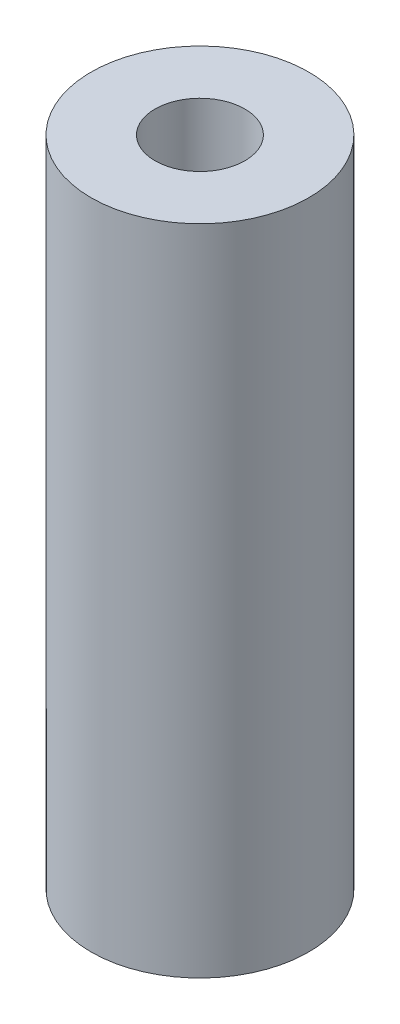
ISO-10303-21;
HEADER;
FILE_DESCRIPTION(('STEP AP214'),'2;1');
FILE_NAME('part.step','',(''),(''),'','','');
FILE_SCHEMA(('AUTOMOTIVE_DESIGN { 1 0 10303 214 1 1 1 1 }'));
ENDSEC;
DATA;
#1=APPLICATION_CONTEXT('core data for automotive mechanical design processes');
#2=APPLICATION_PROTOCOL_DEFINITION('international standard','automotive_design',2000,#1);
#3=PRODUCT_CONTEXT('',#1,'mechanical');
#4=PRODUCT('Part','Part','',(#3));
#5=PRODUCT_RELATED_PRODUCT_CATEGORY('part','',(#4));
#6=PRODUCT_DEFINITION_FORMATION('','',#4);
#7=PRODUCT_DEFINITION_CONTEXT('part definition',#1,'design');
#8=PRODUCT_DEFINITION('design','',#6,#7);
#9=PRODUCT_DEFINITION_SHAPE('','',#8);
#10=(LENGTH_UNIT() NAMED_UNIT(*) SI_UNIT(.MILLI.,.METRE.));
#11=(NAMED_UNIT(*) PLANE_ANGLE_UNIT() SI_UNIT($,.RADIAN.));
#12=(NAMED_UNIT(*) SI_UNIT($,.STERADIAN.) SOLID_ANGLE_UNIT());
#13=UNCERTAINTY_MEASURE_WITH_UNIT(LENGTH_MEASURE(1.E-05),#10,'distance_accuracy_value','');
#14=(GEOMETRIC_REPRESENTATION_CONTEXT(3) GLOBAL_UNCERTAINTY_ASSIGNED_CONTEXT((#13)) GLOBAL_UNIT_ASSIGNED_CONTEXT((#10,
#11,#12)) REPRESENTATION_CONTEXT('',''));
#15=CARTESIAN_POINT('',(0.,0.,0.));
#16=DIRECTION('',(0.,0.,1.));
#17=DIRECTION('',(1.,0.,0.));
#18=AXIS2_PLACEMENT_3D('',#15,#16,#17);
#19=CARTESIAN_POINT('',(0.,24.,0.));
#20=DIRECTION('',(0.,-1.,0.));
#21=DIRECTION('',(0.,0.,-1.));
#22=AXIS2_PLACEMENT_3D('',#19,#20,#21);
#23=CYLINDRICAL_SURFACE('',#22,4.);
#24=CARTESIAN_POINT('',(0.,24.,0.));
#25=DIRECTION('',(0.,1.,0.));
#26=DIRECTION('',(0.,0.,1.));
#27=AXIS2_PLACEMENT_3D('',#24,#25,#26);
#28=CIRCLE('',#27,4.);
#29=CARTESIAN_POINT('',(0.,24.,4.));
#30=VERTEX_POINT('',#29);
#31=EDGE_CURVE('E10',#30,#30,#28,.T.);
#32=ORIENTED_EDGE('',*,*,#31,.F.);
#33=EDGE_LOOP('',(#32));
#34=FACE_BOUND('',#33,.T.);
#35=CARTESIAN_POINT('',(0.,0.,0.));
#36=DIRECTION('',(0.,1.,0.));
#37=DIRECTION('',(0.,0.,1.));
#38=AXIS2_PLACEMENT_3D('',#35,#36,#37);
#39=CIRCLE('',#38,4.);
#40=CARTESIAN_POINT('',(0.,0.,4.));
#41=VERTEX_POINT('',#40);
#42=EDGE_CURVE('E46',#41,#41,#39,.T.);
#43=ORIENTED_EDGE('',*,*,#42,.T.);
#44=EDGE_LOOP('',(#43));
#45=FACE_BOUND('',#44,.T.);
#46=ADVANCED_FACE('F43',(#34,#45),#23,.T.);
#47=CARTESIAN_POINT('',(0.,24.,0.));
#48=DIRECTION('',(0.,1.,0.));
#49=DIRECTION('',(0.,0.,1.));
#50=AXIS2_PLACEMENT_3D('',#47,#48,#49);
#51=PLANE('',#50);
#52=CARTESIAN_POINT('',(0.,24.,0.));
#53=DIRECTION('',(0.,1.,0.));
#54=DIRECTION('',(0.,0.,1.));
#55=AXIS2_PLACEMENT_3D('',#52,#53,#54);
#56=CIRCLE('',#55,1.65);
#57=CARTESIAN_POINT('',(0.,24.,1.65));
#58=VERTEX_POINT('',#57);
#59=EDGE_CURVE('E55',#58,#58,#56,.T.);
#60=ORIENTED_EDGE('',*,*,#59,.F.);
#61=EDGE_LOOP('',(#60));
#62=FACE_BOUND('',#61,.T.);
#63=ORIENTED_EDGE('',*,*,#31,.T.);
#64=EDGE_LOOP('',(#63));
#65=FACE_BOUND('',#64,.T.);
#66=ADVANCED_FACE('F80',(#62,#65),#51,.T.);
#67=CARTESIAN_POINT('',(0.,0.,0.));
#68=DIRECTION('',(0.,1.,0.));
#69=DIRECTION('',(0.,0.,1.));
#70=AXIS2_PLACEMENT_3D('',#67,#68,#69);
#71=PLANE('',#70);
#72=CARTESIAN_POINT('',(0.,0.,0.));
#73=DIRECTION('',(0.,-1.,0.));
#74=DIRECTION('',(0.,0.,-1.));
#75=AXIS2_PLACEMENT_3D('',#72,#73,#74);
#76=CIRCLE('',#75,1.65);
#77=CARTESIAN_POINT('',(0.,0.,-1.65));
#78=VERTEX_POINT('',#77);
#79=EDGE_CURVE('E61',#78,#78,#76,.T.);
#80=ORIENTED_EDGE('',*,*,#79,.F.);
#81=EDGE_LOOP('',(#80));
#82=FACE_BOUND('',#81,.T.);
#83=ORIENTED_EDGE('',*,*,#42,.F.);
#84=EDGE_LOOP('',(#83));
#85=FACE_BOUND('',#84,.T.);
#86=ADVANCED_FACE('F76',(#82,#85),#71,.F.);
#87=CARTESIAN_POINT('',(0.,16.,0.));
#88=DIRECTION('',(0.,1.,0.));
#89=DIRECTION('',(0.,0.,1.));
#90=AXIS2_PLACEMENT_3D('',#87,#88,#89);
#91=CYLINDRICAL_SURFACE('',#90,1.65);
#92=CARTESIAN_POINT('',(0.,16.,0.));
#93=DIRECTION('',(0.,1.,0.));
#94=DIRECTION('',(0.,0.,1.));
#95=AXIS2_PLACEMENT_3D('',#92,#93,#94);
#96=CIRCLE('',#95,1.65);
#97=CARTESIAN_POINT('',(0.,16.,1.65));
#98=VERTEX_POINT('',#97);
#99=EDGE_CURVE('E53',#98,#98,#96,.T.);
#100=ORIENTED_EDGE('',*,*,#99,.F.);
#101=EDGE_LOOP('',(#100));
#102=FACE_BOUND('',#101,.T.);
#103=ORIENTED_EDGE('',*,*,#59,.T.);
#104=EDGE_LOOP('',(#103));
#105=FACE_BOUND('',#104,.T.);
#106=ADVANCED_FACE('F79',(#102,#105),#91,.F.);
#107=CARTESIAN_POINT('',(0.,16.,0.));
#108=DIRECTION('',(0.,1.,0.));
#109=DIRECTION('',(0.,0.,1.));
#110=AXIS2_PLACEMENT_3D('',#107,#108,#109);
#111=PLANE('',#110);
#112=ORIENTED_EDGE('',*,*,#99,.T.);
#113=EDGE_LOOP('',(#112));
#114=FACE_BOUND('',#113,.T.);
#115=ADVANCED_FACE('F72',(#114),#111,.T.);
#116=CARTESIAN_POINT('',(0.,8.,0.));
#117=DIRECTION('',(0.,-1.,0.));
#118=DIRECTION('',(0.,0.,-1.));
#119=AXIS2_PLACEMENT_3D('',#116,#117,#118);
#120=CYLINDRICAL_SURFACE('',#119,1.65);
#121=CARTESIAN_POINT('',(0.,8.,0.));
#122=DIRECTION('',(0.,-1.,0.));
#123=DIRECTION('',(0.,0.,-1.));
#124=AXIS2_PLACEMENT_3D('',#121,#122,#123);
#125=CIRCLE('',#124,1.65);
#126=CARTESIAN_POINT('',(0.,8.,-1.65));
#127=VERTEX_POINT('',#126);
#128=EDGE_CURVE('E58',#127,#127,#125,.T.);
#129=ORIENTED_EDGE('',*,*,#128,.F.);
#130=EDGE_LOOP('',(#129));
#131=FACE_BOUND('',#130,.T.);
#132=ORIENTED_EDGE('',*,*,#79,.T.);
#133=EDGE_LOOP('',(#132));
#134=FACE_BOUND('',#133,.T.);
#135=ADVANCED_FACE('F69',(#131,#134),#120,.F.);
#136=CARTESIAN_POINT('',(0.,8.,0.));
#137=DIRECTION('',(0.,-1.,0.));
#138=DIRECTION('',(0.,0.,-1.));
#139=AXIS2_PLACEMENT_3D('',#136,#137,#138);
#140=PLANE('',#139);
#141=ORIENTED_EDGE('',*,*,#128,.T.);
#142=EDGE_LOOP('',(#141));
#143=FACE_BOUND('',#142,.T.);
#144=ADVANCED_FACE('F67',(#143),#140,.T.);
#145=CLOSED_SHELL('',(#46,#66,#86,#106,#115,#135,#144));
#146=MANIFOLD_SOLID_BREP('B2',#145);
#147=ADVANCED_BREP_SHAPE_REPRESENTATION('',(#18,#146),#14);
#148=SHAPE_DEFINITION_REPRESENTATION(#9,#147);
ENDSEC;
END-ISO-10303-21;
